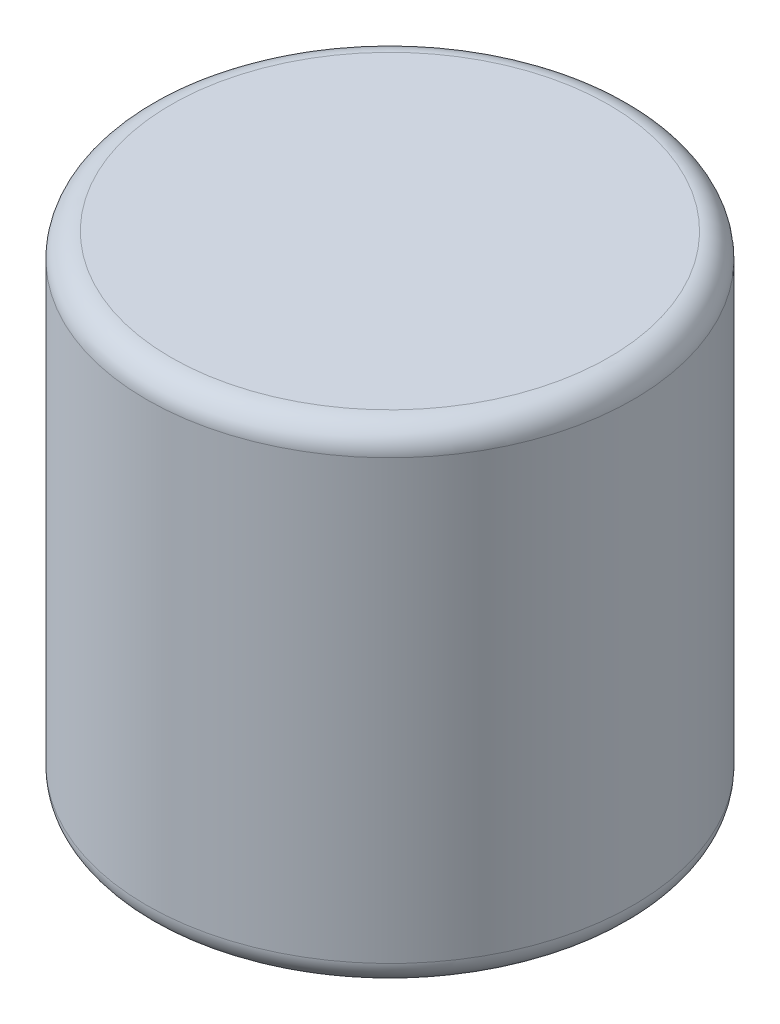
ISO-10303-21;
HEADER;
FILE_DESCRIPTION(('STEP AP214'),'2;1');
FILE_NAME('part.step','',(''),(''),'','','');
FILE_SCHEMA(('AUTOMOTIVE_DESIGN { 1 0 10303 214 1 1 1 1 }'));
ENDSEC;
DATA;
#1=APPLICATION_CONTEXT('core data for automotive mechanical design processes');
#2=APPLICATION_PROTOCOL_DEFINITION('international standard','automotive_design',2000,#1);
#3=PRODUCT_CONTEXT('',#1,'mechanical');
#4=PRODUCT('Part','Part','',(#3));
#5=PRODUCT_RELATED_PRODUCT_CATEGORY('part','',(#4));
#6=PRODUCT_DEFINITION_FORMATION('','',#4);
#7=PRODUCT_DEFINITION_CONTEXT('part definition',#1,'design');
#8=PRODUCT_DEFINITION('design','',#6,#7);
#9=PRODUCT_DEFINITION_SHAPE('','',#8);
#10=(LENGTH_UNIT() NAMED_UNIT(*) SI_UNIT(.MILLI.,.METRE.));
#11=(NAMED_UNIT(*) PLANE_ANGLE_UNIT() SI_UNIT($,.RADIAN.));
#12=(NAMED_UNIT(*) SI_UNIT($,.STERADIAN.) SOLID_ANGLE_UNIT());
#13=UNCERTAINTY_MEASURE_WITH_UNIT(LENGTH_MEASURE(1.E-05),#10,'distance_accuracy_value','');
#14=(GEOMETRIC_REPRESENTATION_CONTEXT(3) GLOBAL_UNCERTAINTY_ASSIGNED_CONTEXT((#13)) GLOBAL_UNIT_ASSIGNED_CONTEXT((#10,
#11,#12)) REPRESENTATION_CONTEXT('',''));
#15=CARTESIAN_POINT('',(0.,0.,0.));
#16=DIRECTION('',(0.,0.,1.));
#17=DIRECTION('',(1.,0.,0.));
#18=AXIS2_PLACEMENT_3D('',#15,#16,#17);
#19=CARTESIAN_POINT('',(0.,2.,0.));
#20=DIRECTION('',(0.,-1.,0.));
#21=DIRECTION('',(0.,0.,-1.));
#22=AXIS2_PLACEMENT_3D('',#19,#20,#21);
#23=CYLINDRICAL_SURFACE('',#22,1.);
#24=CARTESIAN_POINT('',(0.,0.1,0.));
#25=DIRECTION('',(0.,1.,0.));
#26=DIRECTION('',(0.,0.,1.));
#27=AXIS2_PLACEMENT_3D('',#24,#25,#26);
#28=CIRCLE('',#27,1.);
#29=CARTESIAN_POINT('',(0.,0.1,1.));
#30=VERTEX_POINT('',#29);
#31=EDGE_CURVE('E52',#30,#30,#28,.T.);
#32=ORIENTED_EDGE('',*,*,#31,.T.);
#33=EDGE_LOOP('',(#32));
#34=FACE_BOUND('',#33,.T.);
#35=CARTESIAN_POINT('',(0.,1.9,0.));
#36=DIRECTION('',(0.,1.,0.));
#37=DIRECTION('',(0.,0.,1.));
#38=AXIS2_PLACEMENT_3D('',#35,#36,#37);
#39=CIRCLE('',#38,1.);
#40=CARTESIAN_POINT('',(0.,1.9,1.));
#41=VERTEX_POINT('',#40);
#42=EDGE_CURVE('E57',#41,#41,#39,.F.);
#43=ORIENTED_EDGE('',*,*,#42,.T.);
#44=EDGE_LOOP('',(#43));
#45=FACE_BOUND('',#44,.T.);
#46=ADVANCED_FACE('F39',(#34,#45),#23,.T.);
#47=CARTESIAN_POINT('',(0.,2.,0.));
#48=DIRECTION('',(0.,1.,0.));
#49=DIRECTION('',(0.,0.,1.));
#50=AXIS2_PLACEMENT_3D('',#47,#48,#49);
#51=PLANE('',#50);
#52=CARTESIAN_POINT('',(0.,2.,0.));
#53=DIRECTION('',(0.,1.,0.));
#54=DIRECTION('',(0.,0.,1.));
#55=AXIS2_PLACEMENT_3D('',#52,#53,#54);
#56=CIRCLE('',#55,0.9);
#57=CARTESIAN_POINT('',(0.,2.,0.9));
#58=VERTEX_POINT('',#57);
#59=EDGE_CURVE('E10',#58,#58,#56,.T.);
#60=ORIENTED_EDGE('',*,*,#59,.T.);
#61=EDGE_LOOP('',(#60));
#62=FACE_BOUND('',#61,.T.);
#63=ADVANCED_FACE('F74',(#62),#51,.T.);
#64=CARTESIAN_POINT('',(0.,0.,0.));
#65=DIRECTION('',(0.,1.,0.));
#66=DIRECTION('',(0.,0.,1.));
#67=AXIS2_PLACEMENT_3D('',#64,#65,#66);
#68=PLANE('',#67);
#69=CARTESIAN_POINT('',(0.,0.,0.));
#70=DIRECTION('',(0.,1.,0.));
#71=DIRECTION('',(0.,0.,1.));
#72=AXIS2_PLACEMENT_3D('',#69,#70,#71);
#73=CIRCLE('',#72,0.9);
#74=CARTESIAN_POINT('',(0.,0.,0.9));
#75=VERTEX_POINT('',#74);
#76=EDGE_CURVE('E47',#75,#75,#73,.F.);
#77=ORIENTED_EDGE('',*,*,#76,.T.);
#78=EDGE_LOOP('',(#77));
#79=FACE_BOUND('',#78,.T.);
#80=ADVANCED_FACE('F71',(#79),#68,.F.);
#81=CARTESIAN_POINT('',(0.,0.1,0.));
#82=DIRECTION('',(0.,1.,0.));
#83=DIRECTION('',(0.,0.,1.));
#84=AXIS2_PLACEMENT_3D('',#81,#82,#83);
#85=TOROIDAL_SURFACE('',#84,0.9,0.1);
#86=ORIENTED_EDGE('',*,*,#76,.F.);
#87=EDGE_LOOP('',(#86));
#88=FACE_BOUND('',#87,.T.);
#89=ORIENTED_EDGE('',*,*,#31,.F.);
#90=EDGE_LOOP('',(#89));
#91=FACE_BOUND('',#90,.T.);
#92=ADVANCED_FACE('F67',(#88,#91),#85,.T.);
#93=CARTESIAN_POINT('',(0.,1.9,0.));
#94=DIRECTION('',(0.,1.,0.));
#95=DIRECTION('',(0.,0.,1.));
#96=AXIS2_PLACEMENT_3D('',#93,#94,#95);
#97=TOROIDAL_SURFACE('',#96,0.9,0.1);
#98=ORIENTED_EDGE('',*,*,#42,.F.);
#99=EDGE_LOOP('',(#98));
#100=FACE_BOUND('',#99,.T.);
#101=ORIENTED_EDGE('',*,*,#59,.F.);
#102=EDGE_LOOP('',(#101));
#103=FACE_BOUND('',#102,.T.);
#104=ADVANCED_FACE('F41',(#100,#103),#97,.T.);
#105=CLOSED_SHELL('',(#46,#63,#80,#92,#104));
#106=MANIFOLD_SOLID_BREP('B2',#105);
#107=ADVANCED_BREP_SHAPE_REPRESENTATION('',(#18,#106),#14);
#108=SHAPE_DEFINITION_REPRESENTATION(#9,#107);
ENDSEC;
END-ISO-10303-21;
